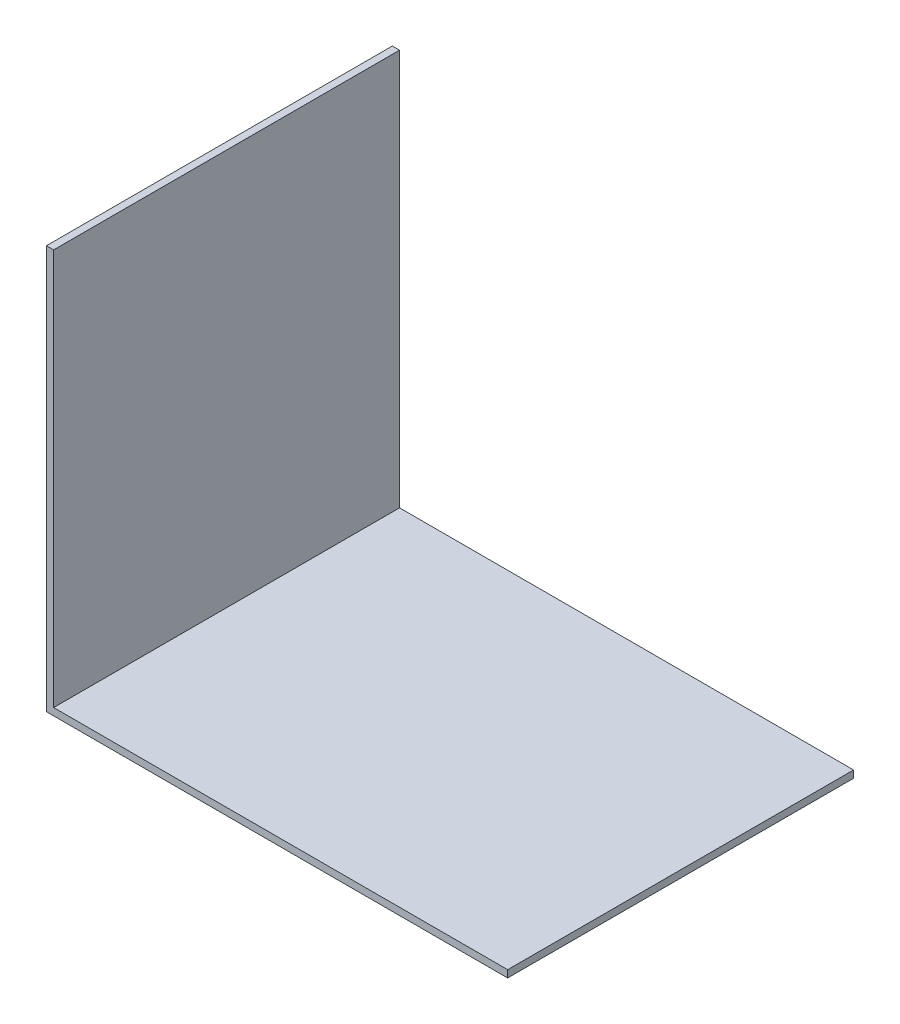
ISO-10303-21;
HEADER;
FILE_DESCRIPTION(('STEP AP214'),'2;1');
FILE_NAME('part.step','',(''),(''),'','','');
FILE_SCHEMA(('AUTOMOTIVE_DESIGN { 1 0 10303 214 1 1 1 1 }'));
ENDSEC;
DATA;
#1=APPLICATION_CONTEXT('core data for automotive mechanical design processes');
#2=APPLICATION_PROTOCOL_DEFINITION('international standard','automotive_design',2000,#1);
#3=PRODUCT_CONTEXT('',#1,'mechanical');
#4=PRODUCT('Part','Part','',(#3));
#5=PRODUCT_RELATED_PRODUCT_CATEGORY('part','',(#4));
#6=PRODUCT_DEFINITION_FORMATION('','',#4);
#7=PRODUCT_DEFINITION_CONTEXT('part definition',#1,'design');
#8=PRODUCT_DEFINITION('design','',#6,#7);
#9=PRODUCT_DEFINITION_SHAPE('','',#8);
#10=(LENGTH_UNIT() NAMED_UNIT(*) SI_UNIT(.MILLI.,.METRE.));
#11=(NAMED_UNIT(*) PLANE_ANGLE_UNIT() SI_UNIT($,.RADIAN.));
#12=(NAMED_UNIT(*) SI_UNIT($,.STERADIAN.) SOLID_ANGLE_UNIT());
#13=UNCERTAINTY_MEASURE_WITH_UNIT(LENGTH_MEASURE(1.E-05),#10,'distance_accuracy_value','');
#14=(GEOMETRIC_REPRESENTATION_CONTEXT(3) GLOBAL_UNCERTAINTY_ASSIGNED_CONTEXT((#13)) GLOBAL_UNIT_ASSIGNED_CONTEXT((#10,
#11,#12)) REPRESENTATION_CONTEXT('',''));
#15=CARTESIAN_POINT('',(0.,0.,0.));
#16=DIRECTION('',(0.,0.,1.));
#17=DIRECTION('',(1.,0.,0.));
#18=AXIS2_PLACEMENT_3D('',#15,#16,#17);
#19=CARTESIAN_POINT('',(24.2882514848805,0.,152.4));
#20=DIRECTION('',(1.,0.,0.));
#21=DIRECTION('',(0.,1.,0.));
#22=AXIS2_PLACEMENT_3D('',#19,#20,#21);
#23=PLANE('',#22);
#24=DIRECTION('',(0.,-1.,0.));
#25=VECTOR('',#24,1.);
#26=CARTESIAN_POINT('',(24.2882514848805,0.,0.));
#27=LINE('',#26,#25);
#28=CARTESIAN_POINT('',(24.2882514848805,199.585646972656,0.));
#29=VERTEX_POINT('',#28);
#30=CARTESIAN_POINT('',(24.2882514848805,24.9606469726562,0.));
#31=VERTEX_POINT('',#30);
#32=EDGE_CURVE('E115',#29,#31,#27,.T.);
#33=ORIENTED_EDGE('',*,*,#32,.F.);
#34=DIRECTION('',(0.,0.,-1.));
#35=VECTOR('',#34,1.);
#36=CARTESIAN_POINT('',(24.2882514848805,199.585646972656,152.4));
#37=LINE('',#36,#35);
#38=CARTESIAN_POINT('',(24.2882514848805,199.585646972656,152.4));
#39=VERTEX_POINT('',#38);
#40=EDGE_CURVE('E11',#39,#29,#37,.T.);
#41=ORIENTED_EDGE('',*,*,#40,.F.);
#42=DIRECTION('',(0.,-1.,0.));
#43=VECTOR('',#42,1.);
#44=CARTESIAN_POINT('',(24.2882514848805,0.,152.4));
#45=LINE('',#44,#43);
#46=CARTESIAN_POINT('',(24.2882514848805,24.9606469726562,152.4));
#47=VERTEX_POINT('',#46);
#48=EDGE_CURVE('E128',#39,#47,#45,.T.);
#49=ORIENTED_EDGE('',*,*,#48,.T.);
#50=DIRECTION('',(0.,0.,-1.));
#51=VECTOR('',#50,1.);
#52=CARTESIAN_POINT('',(24.2882514848805,24.9606469726562,152.4));
#53=LINE('',#52,#51);
#54=EDGE_CURVE('E80',#47,#31,#53,.T.);
#55=ORIENTED_EDGE('',*,*,#54,.T.);
#56=EDGE_LOOP('',(#33,#41,#49,#55));
#57=FACE_BOUND('',#56,.T.);
#58=ADVANCED_FACE('F35',(#57),#23,.T.);
#59=CARTESIAN_POINT('',(0.,199.585646972656,152.4));
#60=DIRECTION('',(0.,1.,0.));
#61=DIRECTION('',(0.,0.,1.));
#62=AXIS2_PLACEMENT_3D('',#59,#60,#61);
#63=PLANE('',#62);
#64=DIRECTION('',(1.,0.,0.));
#65=VECTOR('',#64,1.);
#66=CARTESIAN_POINT('',(0.,199.585646972656,0.));
#67=LINE('',#66,#65);
#68=CARTESIAN_POINT('',(21.1132514848805,199.585646972656,0.));
#69=VERTEX_POINT('',#68);
#70=EDGE_CURVE('E118',#69,#29,#67,.T.);
#71=ORIENTED_EDGE('',*,*,#70,.F.);
#72=DIRECTION('',(0.,0.,-1.));
#73=VECTOR('',#72,1.);
#74=CARTESIAN_POINT('',(21.1132514848805,199.585646972656,152.4));
#75=LINE('',#74,#73);
#76=CARTESIAN_POINT('',(21.1132514848805,199.585646972656,152.4));
#77=VERTEX_POINT('',#76);
#78=EDGE_CURVE('E43',#77,#69,#75,.T.);
#79=ORIENTED_EDGE('',*,*,#78,.F.);
#80=DIRECTION('',(1.,0.,0.));
#81=VECTOR('',#80,1.);
#82=CARTESIAN_POINT('',(0.,199.585646972656,152.4));
#83=LINE('',#82,#81);
#84=EDGE_CURVE('E143',#77,#39,#83,.T.);
#85=ORIENTED_EDGE('',*,*,#84,.T.);
#86=ORIENTED_EDGE('',*,*,#40,.T.);
#87=EDGE_LOOP('',(#71,#79,#85,#86));
#88=FACE_BOUND('',#87,.T.);
#89=ADVANCED_FACE('F137',(#88),#63,.T.);
#90=CARTESIAN_POINT('',(21.1132514848805,0.,152.4));
#91=DIRECTION('',(-1.,0.,0.));
#92=DIRECTION('',(0.,0.,1.));
#93=AXIS2_PLACEMENT_3D('',#90,#91,#92);
#94=PLANE('',#93);
#95=DIRECTION('',(0.,1.,0.));
#96=VECTOR('',#95,1.);
#97=CARTESIAN_POINT('',(21.1132514848805,0.,0.));
#98=LINE('',#97,#96);
#99=CARTESIAN_POINT('',(21.1132514848805,21.7856469726562,0.));
#100=VERTEX_POINT('',#99);
#101=EDGE_CURVE('E121',#100,#69,#98,.T.);
#102=ORIENTED_EDGE('',*,*,#101,.F.);
#103=DIRECTION('',(0.,0.,-1.));
#104=VECTOR('',#103,1.);
#105=CARTESIAN_POINT('',(21.1132514848805,21.7856469726562,152.4));
#106=LINE('',#105,#104);
#107=CARTESIAN_POINT('',(21.1132514848805,21.7856469726562,152.4));
#108=VERTEX_POINT('',#107);
#109=EDGE_CURVE('E107',#108,#100,#106,.T.);
#110=ORIENTED_EDGE('',*,*,#109,.F.);
#111=DIRECTION('',(0.,1.,0.));
#112=VECTOR('',#111,1.);
#113=CARTESIAN_POINT('',(21.1132514848805,0.,152.4));
#114=LINE('',#113,#112);
#115=EDGE_CURVE('E100',#108,#77,#114,.T.);
#116=ORIENTED_EDGE('',*,*,#115,.T.);
#117=ORIENTED_EDGE('',*,*,#78,.T.);
#118=EDGE_LOOP('',(#102,#110,#116,#117));
#119=FACE_BOUND('',#118,.T.);
#120=ADVANCED_FACE('F134',(#119),#94,.T.);
#121=CARTESIAN_POINT('',(0.,21.7856469726562,152.4));
#122=DIRECTION('',(0.,1.,0.));
#123=DIRECTION('',(0.,0.,1.));
#124=AXIS2_PLACEMENT_3D('',#121,#122,#123);
#125=PLANE('',#124);
#126=DIRECTION('',(1.,0.,0.));
#127=VECTOR('',#126,1.);
#128=CARTESIAN_POINT('',(0.,21.7856469726562,0.));
#129=LINE('',#128,#127);
#130=CARTESIAN_POINT('',(224.313251484881,21.7856469726562,0.));
#131=VERTEX_POINT('',#130);
#132=EDGE_CURVE('E106',#100,#131,#129,.T.);
#133=ORIENTED_EDGE('',*,*,#132,.T.);
#134=DIRECTION('',(0.,0.,-1.));
#135=VECTOR('',#134,1.);
#136=CARTESIAN_POINT('',(224.313251484881,21.7856469726562,152.4));
#137=LINE('',#136,#135);
#138=CARTESIAN_POINT('',(224.313251484881,21.7856469726562,152.4));
#139=VERTEX_POINT('',#138);
#140=EDGE_CURVE('E103',#139,#131,#137,.T.);
#141=ORIENTED_EDGE('',*,*,#140,.F.);
#142=DIRECTION('',(1.,0.,0.));
#143=VECTOR('',#142,1.);
#144=CARTESIAN_POINT('',(0.,21.7856469726562,152.4));
#145=LINE('',#144,#143);
#146=EDGE_CURVE('E93',#108,#139,#145,.T.);
#147=ORIENTED_EDGE('',*,*,#146,.F.);
#148=ORIENTED_EDGE('',*,*,#109,.T.);
#149=EDGE_LOOP('',(#133,#141,#147,#148));
#150=FACE_BOUND('',#149,.T.);
#151=ADVANCED_FACE('F104',(#150),#125,.F.);
#152=CARTESIAN_POINT('',(224.313251484881,0.,152.4));
#153=DIRECTION('',(-1.,0.,0.));
#154=DIRECTION('',(0.,-1.,0.));
#155=AXIS2_PLACEMENT_3D('',#152,#153,#154);
#156=PLANE('',#155);
#157=DIRECTION('',(0.,1.,0.));
#158=VECTOR('',#157,1.);
#159=CARTESIAN_POINT('',(224.313251484881,0.,0.));
#160=LINE('',#159,#158);
#161=CARTESIAN_POINT('',(224.313251484881,24.9606469726563,0.));
#162=VERTEX_POINT('',#161);
#163=EDGE_CURVE('E73',#131,#162,#160,.T.);
#164=ORIENTED_EDGE('',*,*,#163,.T.);
#165=DIRECTION('',(0.,0.,-1.));
#166=VECTOR('',#165,1.);
#167=CARTESIAN_POINT('',(224.313251484881,24.9606469726563,152.4));
#168=LINE('',#167,#166);
#169=CARTESIAN_POINT('',(224.313251484881,24.9606469726563,152.4));
#170=VERTEX_POINT('',#169);
#171=EDGE_CURVE('E108',#170,#162,#168,.T.);
#172=ORIENTED_EDGE('',*,*,#171,.F.);
#173=DIRECTION('',(0.,1.,0.));
#174=VECTOR('',#173,1.);
#175=CARTESIAN_POINT('',(224.313251484881,0.,152.4));
#176=LINE('',#175,#174);
#177=EDGE_CURVE('E97',#139,#170,#176,.T.);
#178=ORIENTED_EDGE('',*,*,#177,.F.);
#179=ORIENTED_EDGE('',*,*,#140,.T.);
#180=EDGE_LOOP('',(#164,#172,#178,#179));
#181=FACE_BOUND('',#180,.T.);
#182=ADVANCED_FACE('F110',(#181),#156,.F.);
#183=CARTESIAN_POINT('',(0.,24.9606469726562,152.4));
#184=DIRECTION('',(0.,-1.,0.));
#185=DIRECTION('',(1.,0.,0.));
#186=AXIS2_PLACEMENT_3D('',#183,#184,#185);
#187=PLANE('',#186);
#188=DIRECTION('',(-1.,0.,0.));
#189=VECTOR('',#188,1.);
#190=CARTESIAN_POINT('',(0.,24.9606469726562,0.));
#191=LINE('',#190,#189);
#192=EDGE_CURVE('E126',#162,#31,#191,.T.);
#193=ORIENTED_EDGE('',*,*,#192,.T.);
#194=ORIENTED_EDGE('',*,*,#54,.F.);
#195=DIRECTION('',(-1.,0.,0.));
#196=VECTOR('',#195,1.);
#197=CARTESIAN_POINT('',(0.,24.9606469726562,152.4));
#198=LINE('',#197,#196);
#199=EDGE_CURVE('E51',#170,#47,#198,.T.);
#200=ORIENTED_EDGE('',*,*,#199,.F.);
#201=ORIENTED_EDGE('',*,*,#171,.T.);
#202=EDGE_LOOP('',(#193,#194,#200,#201));
#203=FACE_BOUND('',#202,.T.);
#204=ADVANCED_FACE('F142',(#203),#187,.F.);
#205=CARTESIAN_POINT('',(0.,0.,152.4));
#206=DIRECTION('',(0.,0.,1.));
#207=DIRECTION('',(1.,0.,0.));
#208=AXIS2_PLACEMENT_3D('',#205,#206,#207);
#209=PLANE('',#208);
#210=ORIENTED_EDGE('',*,*,#48,.F.);
#211=ORIENTED_EDGE('',*,*,#84,.F.);
#212=ORIENTED_EDGE('',*,*,#115,.F.);
#213=ORIENTED_EDGE('',*,*,#146,.T.);
#214=ORIENTED_EDGE('',*,*,#177,.T.);
#215=ORIENTED_EDGE('',*,*,#199,.T.);
#216=EDGE_LOOP('',(#210,#211,#212,#213,#214,#215));
#217=FACE_BOUND('',#216,.T.);
#218=ADVANCED_FACE('F95',(#217),#209,.T.);
#219=CARTESIAN_POINT('',(0.,0.,0.));
#220=DIRECTION('',(0.,0.,1.));
#221=DIRECTION('',(1.,0.,0.));
#222=AXIS2_PLACEMENT_3D('',#219,#220,#221);
#223=PLANE('',#222);
#224=ORIENTED_EDGE('',*,*,#32,.T.);
#225=ORIENTED_EDGE('',*,*,#192,.F.);
#226=ORIENTED_EDGE('',*,*,#163,.F.);
#227=ORIENTED_EDGE('',*,*,#132,.F.);
#228=ORIENTED_EDGE('',*,*,#101,.T.);
#229=ORIENTED_EDGE('',*,*,#70,.T.);
#230=EDGE_LOOP('',(#224,#225,#226,#227,#228,#229));
#231=FACE_BOUND('',#230,.T.);
#232=ADVANCED_FACE('F139',(#231),#223,.F.);
#233=CLOSED_SHELL('',(#58,#89,#120,#151,#182,#204,#218,#232));
#234=MANIFOLD_SOLID_BREP('B2',#233);
#235=ADVANCED_BREP_SHAPE_REPRESENTATION('',(#18,#234),#14);
#236=SHAPE_DEFINITION_REPRESENTATION(#9,#235);
ENDSEC;
END-ISO-10303-21;
